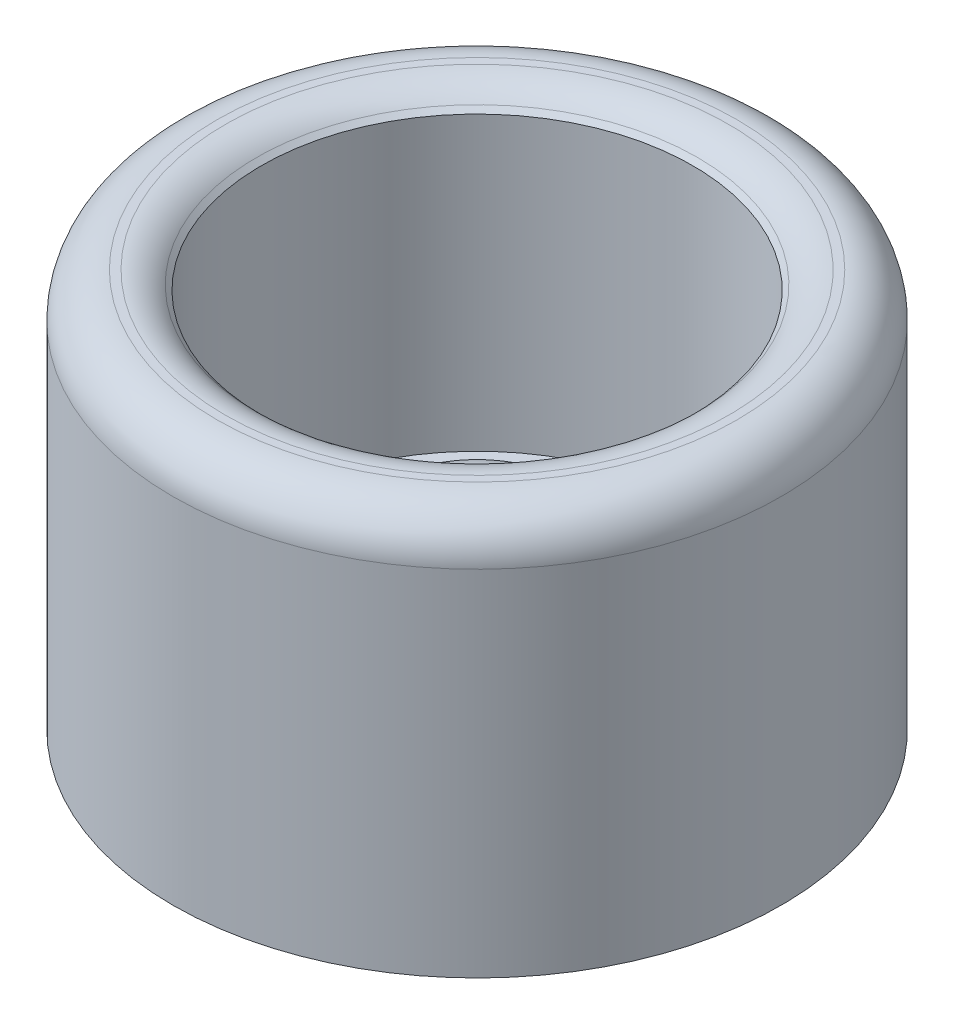
ISO-10303-21;
HEADER;
FILE_DESCRIPTION(('STEP AP214'),'2;1');
FILE_NAME('part.step','',(''),(''),'','','');
FILE_SCHEMA(('AUTOMOTIVE_DESIGN { 1 0 10303 214 1 1 1 1 }'));
ENDSEC;
DATA;
#1=APPLICATION_CONTEXT('core data for automotive mechanical design processes');
#2=APPLICATION_PROTOCOL_DEFINITION('international standard','automotive_design',2000,#1);
#3=PRODUCT_CONTEXT('',#1,'mechanical');
#4=PRODUCT('Part','Part','',(#3));
#5=PRODUCT_RELATED_PRODUCT_CATEGORY('part','',(#4));
#6=PRODUCT_DEFINITION_FORMATION('','',#4);
#7=PRODUCT_DEFINITION_CONTEXT('part definition',#1,'design');
#8=PRODUCT_DEFINITION('design','',#6,#7);
#9=PRODUCT_DEFINITION_SHAPE('','',#8);
#10=(LENGTH_UNIT() NAMED_UNIT(*) SI_UNIT(.MILLI.,.METRE.));
#11=(NAMED_UNIT(*) PLANE_ANGLE_UNIT() SI_UNIT($,.RADIAN.));
#12=(NAMED_UNIT(*) SI_UNIT($,.STERADIAN.) SOLID_ANGLE_UNIT());
#13=UNCERTAINTY_MEASURE_WITH_UNIT(LENGTH_MEASURE(1.E-05),#10,'distance_accuracy_value','');
#14=(GEOMETRIC_REPRESENTATION_CONTEXT(3) GLOBAL_UNCERTAINTY_ASSIGNED_CONTEXT((#13)) GLOBAL_UNIT_ASSIGNED_CONTEXT((#10,
#11,#12)) REPRESENTATION_CONTEXT('',''));
#15=CARTESIAN_POINT('',(0.,0.,0.));
#16=DIRECTION('',(0.,0.,1.));
#17=DIRECTION('',(1.,0.,0.));
#18=AXIS2_PLACEMENT_3D('',#15,#16,#17);
#19=CARTESIAN_POINT('',(0.,35.,0.));
#20=DIRECTION('',(0.,1.,0.));
#21=DIRECTION('',(0.,0.,1.));
#22=AXIS2_PLACEMENT_3D('',#19,#20,#21);
#23=PLANE('',#22);
#24=CARTESIAN_POINT('',(0.,35.,0.));
#25=DIRECTION('',(0.,1.,0.));
#26=DIRECTION('',(0.,0.,1.));
#27=AXIS2_PLACEMENT_3D('',#24,#25,#26);
#28=CIRCLE('',#27,29.384);
#29=CARTESIAN_POINT('',(0.,35.,29.384));
#30=VERTEX_POINT('',#29);
#31=EDGE_CURVE('E57',#30,#30,#28,.T.);
#32=ORIENTED_EDGE('',*,*,#31,.T.);
#33=EDGE_LOOP('',(#32));
#34=FACE_BOUND('',#33,.T.);
#35=CARTESIAN_POINT('',(0.,35.,0.));
#36=DIRECTION('',(0.,1.,0.));
#37=DIRECTION('',(0.,0.,1.));
#38=AXIS2_PLACEMENT_3D('',#35,#36,#37);
#39=CIRCLE('',#38,28.4550678118655);
#40=CARTESIAN_POINT('',(0.,35.,28.4550678118655));
#41=VERTEX_POINT('',#40);
#42=EDGE_CURVE('E62',#41,#41,#39,.F.);
#43=ORIENTED_EDGE('',*,*,#42,.T.);
#44=EDGE_LOOP('',(#43));
#45=FACE_BOUND('',#44,.T.);
#46=ADVANCED_FACE('F44',(#34,#45),#23,.T.);
#47=CARTESIAN_POINT('',(0.,35.,0.));
#48=DIRECTION('',(0.,-1.,0.));
#49=DIRECTION('',(0.,0.,-1.));
#50=AXIS2_PLACEMENT_3D('',#47,#48,#49);
#51=CYLINDRICAL_SURFACE('',#50,34.384);
#52=CARTESIAN_POINT('',(0.,30.,0.));
#53=DIRECTION('',(0.,1.,0.));
#54=DIRECTION('',(0.,0.,1.));
#55=AXIS2_PLACEMENT_3D('',#52,#53,#54);
#56=CIRCLE('',#55,34.384);
#57=CARTESIAN_POINT('',(0.,30.,34.384));
#58=VERTEX_POINT('',#57);
#59=EDGE_CURVE('E52',#58,#58,#56,.F.);
#60=ORIENTED_EDGE('',*,*,#59,.T.);
#61=EDGE_LOOP('',(#60));
#62=FACE_BOUND('',#61,.T.);
#63=CARTESIAN_POINT('',(0.,-10.,0.));
#64=DIRECTION('',(0.,1.,0.));
#65=DIRECTION('',(0.,0.,1.));
#66=AXIS2_PLACEMENT_3D('',#63,#64,#65);
#67=CIRCLE('',#66,34.384);
#68=CARTESIAN_POINT('',(0.,-10.,34.384));
#69=VERTEX_POINT('',#68);
#70=EDGE_CURVE('E101',#69,#69,#67,.T.);
#71=ORIENTED_EDGE('',*,*,#70,.T.);
#72=EDGE_LOOP('',(#71));
#73=FACE_BOUND('',#72,.T.);
#74=ADVANCED_FACE('F117',(#62,#73),#51,.T.);
#75=CARTESIAN_POINT('',(0.,35.,0.));
#76=DIRECTION('',(0.,-1.,0.));
#77=DIRECTION('',(0.,0.,-1.));
#78=AXIS2_PLACEMENT_3D('',#75,#76,#77);
#79=CYLINDRICAL_SURFACE('',#78,24.384);
#80=CARTESIAN_POINT('',(0.,33.,0.));
#81=DIRECTION('',(0.,1.,0.));
#82=DIRECTION('',(0.,0.,1.));
#83=AXIS2_PLACEMENT_3D('',#80,#81,#82);
#84=CIRCLE('',#83,24.384);
#85=CARTESIAN_POINT('',(0.,33.,24.384));
#86=VERTEX_POINT('',#85);
#87=EDGE_CURVE('E89',#86,#86,#84,.T.);
#88=ORIENTED_EDGE('',*,*,#87,.T.);
#89=EDGE_LOOP('',(#88));
#90=FACE_BOUND('',#89,.T.);
#91=CARTESIAN_POINT('',(0.,0.,0.));
#92=DIRECTION('',(0.,1.,0.));
#93=DIRECTION('',(0.,0.,1.));
#94=AXIS2_PLACEMENT_3D('',#91,#92,#93);
#95=CIRCLE('',#94,24.384);
#96=CARTESIAN_POINT('',(0.,0.,24.384));
#97=VERTEX_POINT('',#96);
#98=EDGE_CURVE('E109',#97,#97,#95,.T.);
#99=ORIENTED_EDGE('',*,*,#98,.F.);
#100=EDGE_LOOP('',(#99));
#101=FACE_BOUND('',#100,.T.);
#102=ADVANCED_FACE('F134',(#90,#101),#79,.F.);
#103=CARTESIAN_POINT('',(0.,0.,0.));
#104=DIRECTION('',(0.,1.,0.));
#105=DIRECTION('',(0.,0.,1.));
#106=AXIS2_PLACEMENT_3D('',#103,#104,#105);
#107=PLANE('',#106);
#108=CARTESIAN_POINT('',(0.,0.,0.));
#109=DIRECTION('',(0.,1.,0.));
#110=DIRECTION('',(0.,0.,1.));
#111=AXIS2_PLACEMENT_3D('',#108,#109,#110);
#112=CIRCLE('',#111,17.5);
#113=CARTESIAN_POINT('',(0.,0.,17.5));
#114=VERTEX_POINT('',#113);
#115=EDGE_CURVE('E93',#114,#114,#112,.F.);
#116=ORIENTED_EDGE('',*,*,#115,.T.);
#117=EDGE_LOOP('',(#116));
#118=FACE_BOUND('',#117,.T.);
#119=ORIENTED_EDGE('',*,*,#98,.T.);
#120=EDGE_LOOP('',(#119));
#121=FACE_BOUND('',#120,.T.);
#122=ADVANCED_FACE('F122',(#118,#121),#107,.T.);
#123=CARTESIAN_POINT('',(0.,-10.,0.));
#124=DIRECTION('',(0.,1.,0.));
#125=DIRECTION('',(0.,0.,1.));
#126=AXIS2_PLACEMENT_3D('',#123,#124,#125);
#127=PLANE('',#126);
#128=CARTESIAN_POINT('',(0.,-10.,0.));
#129=DIRECTION('',(0.,1.,0.));
#130=DIRECTION('',(0.,0.,1.));
#131=AXIS2_PLACEMENT_3D('',#128,#129,#130);
#132=CIRCLE('',#131,5.99999999999999);
#133=CARTESIAN_POINT('',(0.,-10.,5.99999999999999));
#134=VERTEX_POINT('',#133);
#135=EDGE_CURVE('E81',#134,#134,#132,.T.);
#136=ORIENTED_EDGE('',*,*,#135,.T.);
#137=EDGE_LOOP('',(#136));
#138=FACE_BOUND('',#137,.T.);
#139=ORIENTED_EDGE('',*,*,#70,.F.);
#140=EDGE_LOOP('',(#139));
#141=FACE_BOUND('',#140,.T.);
#142=ADVANCED_FACE('F119',(#138,#141),#127,.F.);
#143=CARTESIAN_POINT('',(0.,10.,0.));
#144=DIRECTION('',(0.,1.,0.));
#145=DIRECTION('',(0.,0.,1.));
#146=AXIS2_PLACEMENT_3D('',#143,#144,#145);
#147=PLANE('',#146);
#148=CARTESIAN_POINT('',(0.,10.,0.));
#149=DIRECTION('',(0.,1.,0.));
#150=DIRECTION('',(0.,0.,1.));
#151=AXIS2_PLACEMENT_3D('',#148,#149,#150);
#152=CIRCLE('',#151,4.49999999999999);
#153=CARTESIAN_POINT('',(0.,10.,4.49999999999999));
#154=VERTEX_POINT('',#153);
#155=EDGE_CURVE('E73',#154,#154,#152,.T.);
#156=ORIENTED_EDGE('',*,*,#155,.F.);
#157=EDGE_LOOP('',(#156));
#158=FACE_BOUND('',#157,.T.);
#159=CARTESIAN_POINT('',(0.,10.,0.));
#160=DIRECTION('',(0.,1.,0.));
#161=DIRECTION('',(0.,0.,1.));
#162=AXIS2_PLACEMENT_3D('',#159,#160,#161);
#163=CIRCLE('',#162,7.5);
#164=CARTESIAN_POINT('',(0.,10.,7.5));
#165=VERTEX_POINT('',#164);
#166=EDGE_CURVE('E105',#165,#165,#163,.T.);
#167=ORIENTED_EDGE('',*,*,#166,.T.);
#168=EDGE_LOOP('',(#167));
#169=FACE_BOUND('',#168,.T.);
#170=ADVANCED_FACE('F121',(#158,#169),#147,.T.);
#171=CARTESIAN_POINT('',(0.,5.,0.));
#172=DIRECTION('',(0.,1.,0.));
#173=DIRECTION('',(0.,0.,1.));
#174=AXIS2_PLACEMENT_3D('',#171,#172,#173);
#175=TOROIDAL_SURFACE('',#174,17.5,5.);
#176=ORIENTED_EDGE('',*,*,#115,.F.);
#177=EDGE_LOOP('',(#176));
#178=FACE_BOUND('',#177,.T.);
#179=CARTESIAN_POINT('',(0.,5.,0.));
#180=DIRECTION('',(0.,1.,0.));
#181=DIRECTION('',(0.,0.,1.));
#182=AXIS2_PLACEMENT_3D('',#179,#180,#181);
#183=CIRCLE('',#182,12.5);
#184=CARTESIAN_POINT('',(0.,5.,12.5));
#185=VERTEX_POINT('',#184);
#186=EDGE_CURVE('E97',#185,#185,#183,.T.);
#187=ORIENTED_EDGE('',*,*,#186,.F.);
#188=EDGE_LOOP('',(#187));
#189=FACE_BOUND('',#188,.T.);
#190=ADVANCED_FACE('F130',(#178,#189),#175,.F.);
#191=CARTESIAN_POINT('',(0.,5.,0.));
#192=DIRECTION('',(0.,1.,0.));
#193=DIRECTION('',(0.,0.,1.));
#194=AXIS2_PLACEMENT_3D('',#191,#192,#193);
#195=TOROIDAL_SURFACE('',#194,7.5,5.);
#196=ORIENTED_EDGE('',*,*,#186,.T.);
#197=EDGE_LOOP('',(#196));
#198=FACE_BOUND('',#197,.T.);
#199=ORIENTED_EDGE('',*,*,#166,.F.);
#200=EDGE_LOOP('',(#199));
#201=FACE_BOUND('',#200,.T.);
#202=ADVANCED_FACE('F148',(#198,#201),#195,.T.);
#203=CARTESIAN_POINT('',(0.,-10.,0.));
#204=DIRECTION('',(0.,-1.,0.));
#205=DIRECTION('',(0.,0.,-1.));
#206=AXIS2_PLACEMENT_3D('',#203,#204,#205);
#207=CYLINDRICAL_SURFACE('',#206,5.5);
#208=CARTESIAN_POINT('',(0.,-0.499999999999988,0.));
#209=DIRECTION('',(0.,1.,0.));
#210=DIRECTION('',(0.,0.,1.));
#211=AXIS2_PLACEMENT_3D('',#208,#209,#210);
#212=CIRCLE('',#211,5.5);
#213=CARTESIAN_POINT('',(0.,-0.499999999999988,5.5));
#214=VERTEX_POINT('',#213);
#215=EDGE_CURVE('E77',#214,#214,#212,.T.);
#216=ORIENTED_EDGE('',*,*,#215,.T.);
#217=EDGE_LOOP('',(#216));
#218=FACE_BOUND('',#217,.T.);
#219=CARTESIAN_POINT('',(0.,-9.5,0.));
#220=DIRECTION('',(0.,1.,0.));
#221=DIRECTION('',(0.,0.,1.));
#222=AXIS2_PLACEMENT_3D('',#219,#220,#221);
#223=CIRCLE('',#222,5.5);
#224=CARTESIAN_POINT('',(0.,-9.5,5.5));
#225=VERTEX_POINT('',#224);
#226=EDGE_CURVE('E85',#225,#225,#223,.F.);
#227=ORIENTED_EDGE('',*,*,#226,.T.);
#228=EDGE_LOOP('',(#227));
#229=FACE_BOUND('',#228,.T.);
#230=ADVANCED_FACE('F151',(#218,#229),#207,.F.);
#231=CARTESIAN_POINT('',(0.,0.,0.));
#232=DIRECTION('',(0.,-1.,0.));
#233=DIRECTION('',(0.,0.,-1.));
#234=AXIS2_PLACEMENT_3D('',#231,#232,#233);
#235=CYLINDRICAL_SURFACE('',#234,4.49999999999999);
#236=CARTESIAN_POINT('',(0.,0.500000000000003,0.));
#237=DIRECTION('',(0.,1.,0.));
#238=DIRECTION('',(0.,0.,1.));
#239=AXIS2_PLACEMENT_3D('',#236,#237,#238);
#240=CIRCLE('',#239,4.49999999999999);
#241=CARTESIAN_POINT('',(0.,0.500000000000003,4.49999999999999));
#242=VERTEX_POINT('',#241);
#243=EDGE_CURVE('E68',#242,#242,#240,.F.);
#244=ORIENTED_EDGE('',*,*,#243,.T.);
#245=EDGE_LOOP('',(#244));
#246=FACE_BOUND('',#245,.T.);
#247=ORIENTED_EDGE('',*,*,#155,.T.);
#248=EDGE_LOOP('',(#247));
#249=FACE_BOUND('',#248,.T.);
#250=ADVANCED_FACE('F164',(#246,#249),#235,.F.);
#251=CARTESIAN_POINT('',(0.,33.,0.));
#252=DIRECTION('',(0.,1.,0.));
#253=DIRECTION('',(0.,0.,1.));
#254=AXIS2_PLACEMENT_3D('',#251,#252,#253);
#255=CONICAL_SURFACE('',#254,24.384,0.785398163397447);
#256=CARTESIAN_POINT('',(0.,33.5355339059327,0.));
#257=DIRECTION('',(0.,-1.,0.));
#258=DIRECTION('',(0.,0.,-1.));
#259=AXIS2_PLACEMENT_3D('',#256,#257,#258);
#260=CIRCLE('',#259,24.9195339059327);
#261=CARTESIAN_POINT('',(0.,33.5355339059327,-24.9195339059327));
#262=VERTEX_POINT('',#261);
#263=EDGE_CURVE('E11',#262,#262,#260,.F.);
#264=ORIENTED_EDGE('',*,*,#263,.T.);
#265=EDGE_LOOP('',(#264));
#266=FACE_BOUND('',#265,.T.);
#267=ORIENTED_EDGE('',*,*,#87,.F.);
#268=EDGE_LOOP('',(#267));
#269=FACE_BOUND('',#268,.T.);
#270=ADVANCED_FACE('F157',(#266,#269),#255,.F.);
#271=CARTESIAN_POINT('',(0.,-9.5,0.));
#272=DIRECTION('',(0.,-1.,0.));
#273=DIRECTION('',(0.,0.,-1.));
#274=AXIS2_PLACEMENT_3D('',#271,#272,#273);
#275=CONICAL_SURFACE('',#274,5.5,0.785398163397443);
#276=ORIENTED_EDGE('',*,*,#135,.F.);
#277=EDGE_LOOP('',(#276));
#278=FACE_BOUND('',#277,.T.);
#279=ORIENTED_EDGE('',*,*,#226,.F.);
#280=EDGE_LOOP('',(#279));
#281=FACE_BOUND('',#280,.T.);
#282=ADVANCED_FACE('F163',(#278,#281),#275,.F.);
#283=CARTESIAN_POINT('',(0.,0.500000000000003,0.));
#284=DIRECTION('',(0.,-1.,0.));
#285=DIRECTION('',(0.,0.,-1.));
#286=AXIS2_PLACEMENT_3D('',#283,#284,#285);
#287=CONICAL_SURFACE('',#286,4.49999999999999,0.785398163397444);
#288=ORIENTED_EDGE('',*,*,#243,.F.);
#289=EDGE_LOOP('',(#288));
#290=FACE_BOUND('',#289,.T.);
#291=CARTESIAN_POINT('',(0.,0.,0.));
#292=DIRECTION('',(0.,1.,0.));
#293=DIRECTION('',(0.,0.,1.));
#294=AXIS2_PLACEMENT_3D('',#291,#292,#293);
#295=CIRCLE('',#294,4.99999999999999);
#296=CARTESIAN_POINT('',(0.,0.,4.99999999999999));
#297=VERTEX_POINT('',#296);
#298=EDGE_CURVE('E69',#297,#297,#295,.T.);
#299=ORIENTED_EDGE('',*,*,#298,.F.);
#300=EDGE_LOOP('',(#299));
#301=FACE_BOUND('',#300,.T.);
#302=ADVANCED_FACE('F170',(#290,#301),#287,.F.);
#303=CARTESIAN_POINT('',(0.,0.,0.));
#304=DIRECTION('',(0.,-1.,0.));
#305=DIRECTION('',(0.,0.,-1.));
#306=AXIS2_PLACEMENT_3D('',#303,#304,#305);
#307=CONICAL_SURFACE('',#306,5.,0.785398163397453);
#308=ORIENTED_EDGE('',*,*,#215,.F.);
#309=EDGE_LOOP('',(#308));
#310=FACE_BOUND('',#309,.T.);
#311=ORIENTED_EDGE('',*,*,#298,.T.);
#312=EDGE_LOOP('',(#311));
#313=FACE_BOUND('',#312,.T.);
#314=ADVANCED_FACE('F173',(#310,#313),#307,.F.);
#315=CARTESIAN_POINT('',(0.,30.,0.));
#316=DIRECTION('',(0.,1.,0.));
#317=DIRECTION('',(0.,0.,1.));
#318=AXIS2_PLACEMENT_3D('',#315,#316,#317);
#319=TOROIDAL_SURFACE('',#318,29.384,5.);
#320=ORIENTED_EDGE('',*,*,#59,.F.);
#321=EDGE_LOOP('',(#320));
#322=FACE_BOUND('',#321,.T.);
#323=ORIENTED_EDGE('',*,*,#31,.F.);
#324=EDGE_LOOP('',(#323));
#325=FACE_BOUND('',#324,.T.);
#326=ADVANCED_FACE('F178',(#322,#325),#319,.T.);
#327=CARTESIAN_POINT('',(0.,30.,0.));
#328=DIRECTION('',(0.,1.,0.));
#329=DIRECTION('',(0.,0.,1.));
#330=AXIS2_PLACEMENT_3D('',#327,#328,#329);
#331=TOROIDAL_SURFACE('',#330,28.4550678118655,5.);
#332=ORIENTED_EDGE('',*,*,#263,.F.);
#333=EDGE_LOOP('',(#332));
#334=FACE_BOUND('',#333,.T.);
#335=ORIENTED_EDGE('',*,*,#42,.F.);
#336=EDGE_LOOP('',(#335));
#337=FACE_BOUND('',#336,.T.);
#338=ADVANCED_FACE('F46',(#334,#337),#331,.T.);
#339=CLOSED_SHELL('',(#46,#74,#102,#122,#142,#170,#190,#202,#230,#250,#270,#282,#302,#314,#326,#338));
#340=MANIFOLD_SOLID_BREP('B2',#339);
#341=ADVANCED_BREP_SHAPE_REPRESENTATION('',(#18,#340),#14);
#342=SHAPE_DEFINITION_REPRESENTATION(#9,#341);
ENDSEC;
END-ISO-10303-21;
